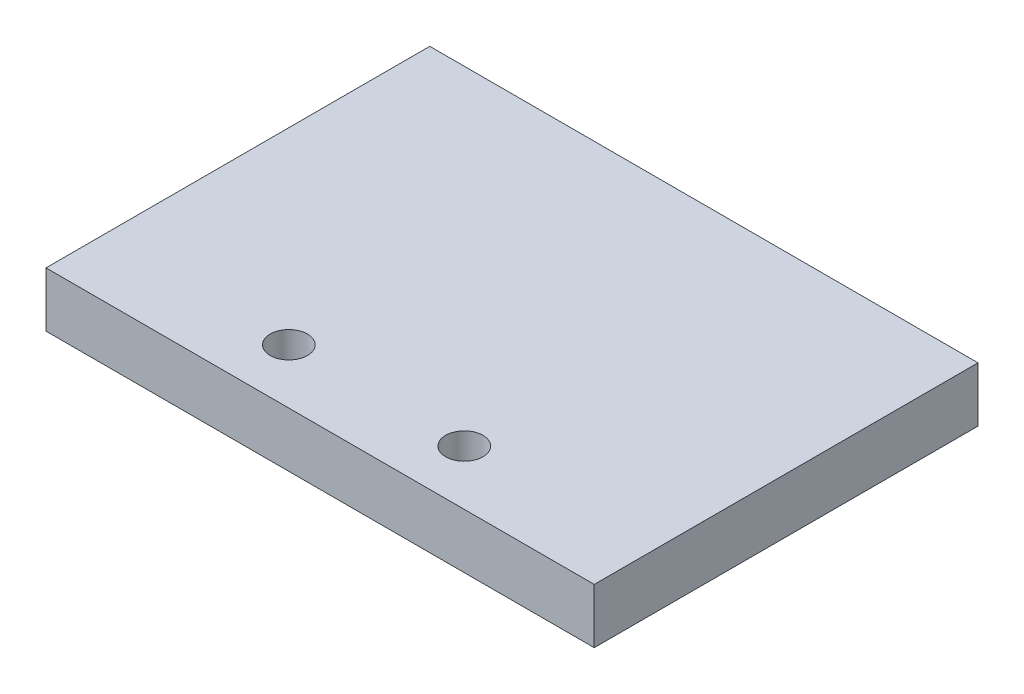
ISO-10303-21;
HEADER;
FILE_DESCRIPTION(('STEP AP214'),'2;1');
FILE_NAME('part.step','',(''),(''),'','','');
FILE_SCHEMA(('AUTOMOTIVE_DESIGN { 1 0 10303 214 1 1 1 1 }'));
ENDSEC;
DATA;
#1=APPLICATION_CONTEXT('core data for automotive mechanical design processes');
#2=APPLICATION_PROTOCOL_DEFINITION('international standard','automotive_design',2000,#1);
#3=PRODUCT_CONTEXT('',#1,'mechanical');
#4=PRODUCT('Part','Part','',(#3));
#5=PRODUCT_RELATED_PRODUCT_CATEGORY('part','',(#4));
#6=PRODUCT_DEFINITION_FORMATION('','',#4);
#7=PRODUCT_DEFINITION_CONTEXT('part definition',#1,'design');
#8=PRODUCT_DEFINITION('design','',#6,#7);
#9=PRODUCT_DEFINITION_SHAPE('','',#8);
#10=(LENGTH_UNIT() NAMED_UNIT(*) SI_UNIT(.MILLI.,.METRE.));
#11=(NAMED_UNIT(*) PLANE_ANGLE_UNIT() SI_UNIT($,.RADIAN.));
#12=(NAMED_UNIT(*) SI_UNIT($,.STERADIAN.) SOLID_ANGLE_UNIT());
#13=UNCERTAINTY_MEASURE_WITH_UNIT(LENGTH_MEASURE(1.E-05),#10,'distance_accuracy_value','');
#14=(GEOMETRIC_REPRESENTATION_CONTEXT(3) GLOBAL_UNCERTAINTY_ASSIGNED_CONTEXT((#13)) GLOBAL_UNIT_ASSIGNED_CONTEXT((#10,
#11,#12)) REPRESENTATION_CONTEXT('',''));
#15=CARTESIAN_POINT('',(0.,0.,0.));
#16=DIRECTION('',(0.,0.,1.));
#17=DIRECTION('',(1.,0.,0.));
#18=AXIS2_PLACEMENT_3D('',#15,#16,#17);
#19=CARTESIAN_POINT('',(25.,5.,17.5));
#20=DIRECTION('',(-1.,0.,0.));
#21=DIRECTION('',(0.,0.,1.));
#22=AXIS2_PLACEMENT_3D('',#19,#20,#21);
#23=PLANE('',#22);
#24=DIRECTION('',(0.,0.,-1.));
#25=VECTOR('',#24,1.);
#26=CARTESIAN_POINT('',(25.,0.,17.5));
#27=LINE('',#26,#25);
#28=CARTESIAN_POINT('',(25.,0.,17.5));
#29=VERTEX_POINT('',#28);
#30=CARTESIAN_POINT('',(25.,0.,-17.5));
#31=VERTEX_POINT('',#30);
#32=EDGE_CURVE('E96',#29,#31,#27,.T.);
#33=ORIENTED_EDGE('',*,*,#32,.T.);
#34=DIRECTION('',(0.,-1.,0.));
#35=VECTOR('',#34,1.);
#36=CARTESIAN_POINT('',(25.,5.,-17.5));
#37=LINE('',#36,#35);
#38=CARTESIAN_POINT('',(25.,5.,-17.5));
#39=VERTEX_POINT('',#38);
#40=EDGE_CURVE('E11',#39,#31,#37,.T.);
#41=ORIENTED_EDGE('',*,*,#40,.F.);
#42=DIRECTION('',(0.,0.,-1.));
#43=VECTOR('',#42,1.);
#44=CARTESIAN_POINT('',(25.,5.,17.5));
#45=LINE('',#44,#43);
#46=CARTESIAN_POINT('',(25.,5.,17.5));
#47=VERTEX_POINT('',#46);
#48=EDGE_CURVE('E84',#47,#39,#45,.T.);
#49=ORIENTED_EDGE('',*,*,#48,.F.);
#50=DIRECTION('',(0.,-1.,0.));
#51=VECTOR('',#50,1.);
#52=CARTESIAN_POINT('',(25.,5.,17.5));
#53=LINE('',#52,#51);
#54=EDGE_CURVE('E92',#47,#29,#53,.T.);
#55=ORIENTED_EDGE('',*,*,#54,.T.);
#56=EDGE_LOOP('',(#33,#41,#49,#55));
#57=FACE_BOUND('',#56,.T.);
#58=ADVANCED_FACE('F33',(#57),#23,.F.);
#59=CARTESIAN_POINT('',(-25.,5.,-17.5));
#60=DIRECTION('',(0.,0.,1.));
#61=DIRECTION('',(1.,0.,0.));
#62=AXIS2_PLACEMENT_3D('',#59,#60,#61);
#63=PLANE('',#62);
#64=DIRECTION('',(-1.,0.,0.));
#65=VECTOR('',#64,1.);
#66=CARTESIAN_POINT('',(-25.,0.,-17.5));
#67=LINE('',#66,#65);
#68=CARTESIAN_POINT('',(-25.,0.,-17.5));
#69=VERTEX_POINT('',#68);
#70=EDGE_CURVE('E88',#31,#69,#67,.T.);
#71=ORIENTED_EDGE('',*,*,#70,.T.);
#72=DIRECTION('',(0.,-1.,0.));
#73=VECTOR('',#72,1.);
#74=CARTESIAN_POINT('',(-25.,5.,-17.5));
#75=LINE('',#74,#73);
#76=CARTESIAN_POINT('',(-25.,5.,-17.5));
#77=VERTEX_POINT('',#76);
#78=EDGE_CURVE('E41',#77,#69,#75,.T.);
#79=ORIENTED_EDGE('',*,*,#78,.F.);
#80=DIRECTION('',(-1.,0.,0.));
#81=VECTOR('',#80,1.);
#82=CARTESIAN_POINT('',(-25.,5.,-17.5));
#83=LINE('',#82,#81);
#84=EDGE_CURVE('E79',#39,#77,#83,.T.);
#85=ORIENTED_EDGE('',*,*,#84,.F.);
#86=ORIENTED_EDGE('',*,*,#40,.T.);
#87=EDGE_LOOP('',(#71,#79,#85,#86));
#88=FACE_BOUND('',#87,.T.);
#89=ADVANCED_FACE('F87',(#88),#63,.F.);
#90=CARTESIAN_POINT('',(-25.,5.,17.5));
#91=DIRECTION('',(1.,0.,0.));
#92=DIRECTION('',(0.,0.,-1.));
#93=AXIS2_PLACEMENT_3D('',#90,#91,#92);
#94=PLANE('',#93);
#95=DIRECTION('',(0.,0.,1.));
#96=VECTOR('',#95,1.);
#97=CARTESIAN_POINT('',(-25.,0.,17.5));
#98=LINE('',#97,#96);
#99=CARTESIAN_POINT('',(-25.,0.,17.5));
#100=VERTEX_POINT('',#99);
#101=EDGE_CURVE('E66',#69,#100,#98,.T.);
#102=ORIENTED_EDGE('',*,*,#101,.T.);
#103=DIRECTION('',(0.,-1.,0.));
#104=VECTOR('',#103,1.);
#105=CARTESIAN_POINT('',(-25.,5.,17.5));
#106=LINE('',#105,#104);
#107=CARTESIAN_POINT('',(-25.,5.,17.5));
#108=VERTEX_POINT('',#107);
#109=EDGE_CURVE('E89',#108,#100,#106,.T.);
#110=ORIENTED_EDGE('',*,*,#109,.F.);
#111=DIRECTION('',(0.,0.,1.));
#112=VECTOR('',#111,1.);
#113=CARTESIAN_POINT('',(-25.,5.,17.5));
#114=LINE('',#113,#112);
#115=EDGE_CURVE('E82',#77,#108,#114,.T.);
#116=ORIENTED_EDGE('',*,*,#115,.F.);
#117=ORIENTED_EDGE('',*,*,#78,.T.);
#118=EDGE_LOOP('',(#102,#110,#116,#117));
#119=FACE_BOUND('',#118,.T.);
#120=ADVANCED_FACE('F90',(#119),#94,.F.);
#121=CARTESIAN_POINT('',(-25.,5.,17.5));
#122=DIRECTION('',(0.,0.,-1.));
#123=DIRECTION('',(-1.,0.,0.));
#124=AXIS2_PLACEMENT_3D('',#121,#122,#123);
#125=PLANE('',#124);
#126=DIRECTION('',(1.,0.,0.));
#127=VECTOR('',#126,1.);
#128=CARTESIAN_POINT('',(-25.,0.,17.5));
#129=LINE('',#128,#127);
#130=EDGE_CURVE('E72',#100,#29,#129,.T.);
#131=ORIENTED_EDGE('',*,*,#130,.T.);
#132=ORIENTED_EDGE('',*,*,#54,.F.);
#133=DIRECTION('',(1.,0.,0.));
#134=VECTOR('',#133,1.);
#135=CARTESIAN_POINT('',(-25.,5.,17.5));
#136=LINE('',#135,#134);
#137=EDGE_CURVE('E49',#108,#47,#136,.T.);
#138=ORIENTED_EDGE('',*,*,#137,.F.);
#139=ORIENTED_EDGE('',*,*,#109,.T.);
#140=EDGE_LOOP('',(#131,#132,#138,#139));
#141=FACE_BOUND('',#140,.T.);
#142=ADVANCED_FACE('F104',(#141),#125,.F.);
#143=CARTESIAN_POINT('',(0.,5.,0.));
#144=DIRECTION('',(0.,-1.,0.));
#145=DIRECTION('',(0.,0.,-1.));
#146=AXIS2_PLACEMENT_3D('',#143,#144,#145);
#147=PLANE('',#146);
#148=CARTESIAN_POINT('',(-7.85313595425129,5.,12.5));
#149=DIRECTION('',(0.,1.,0.));
#150=DIRECTION('',(0.,0.,1.));
#151=AXIS2_PLACEMENT_3D('',#148,#149,#150);
#152=CIRCLE('',#151,1.69999999999999);
#153=CARTESIAN_POINT('',(-7.85313595425129,5.,14.2));
#154=VERTEX_POINT('',#153);
#155=EDGE_CURVE('E118',#154,#154,#152,.T.);
#156=ORIENTED_EDGE('',*,*,#155,.F.);
#157=EDGE_LOOP('',(#156));
#158=FACE_BOUND('',#157,.T.);
#159=CARTESIAN_POINT('',(8.14686404574871,5.,12.5));
#160=DIRECTION('',(0.,1.,0.));
#161=DIRECTION('',(0.,0.,1.));
#162=AXIS2_PLACEMENT_3D('',#159,#160,#161);
#163=CIRCLE('',#162,1.69999999999999);
#164=CARTESIAN_POINT('',(8.14686404574871,5.,14.2));
#165=VERTEX_POINT('',#164);
#166=EDGE_CURVE('E112',#165,#165,#163,.T.);
#167=ORIENTED_EDGE('',*,*,#166,.F.);
#168=EDGE_LOOP('',(#167));
#169=FACE_BOUND('',#168,.T.);
#170=ORIENTED_EDGE('',*,*,#48,.T.);
#171=ORIENTED_EDGE('',*,*,#84,.T.);
#172=ORIENTED_EDGE('',*,*,#115,.T.);
#173=ORIENTED_EDGE('',*,*,#137,.T.);
#174=EDGE_LOOP('',(#170,#171,#172,#173));
#175=FACE_BOUND('',#174,.T.);
#176=ADVANCED_FACE('F80',(#158,#169,#175),#147,.F.);
#177=CARTESIAN_POINT('',(0.,0.,0.));
#178=DIRECTION('',(0.,-1.,0.));
#179=DIRECTION('',(0.,0.,-1.));
#180=AXIS2_PLACEMENT_3D('',#177,#178,#179);
#181=PLANE('',#180);
#182=CARTESIAN_POINT('',(-7.85313595425129,0.,12.5));
#183=DIRECTION('',(0.,1.,0.));
#184=DIRECTION('',(0.,0.,1.));
#185=AXIS2_PLACEMENT_3D('',#182,#183,#184);
#186=CIRCLE('',#185,1.7);
#187=CARTESIAN_POINT('',(-7.85313595425129,0.,14.2));
#188=VERTEX_POINT('',#187);
#189=EDGE_CURVE('E115',#188,#188,#186,.T.);
#190=ORIENTED_EDGE('',*,*,#189,.T.);
#191=EDGE_LOOP('',(#190));
#192=FACE_BOUND('',#191,.T.);
#193=CARTESIAN_POINT('',(8.14686404574871,0.,12.5));
#194=DIRECTION('',(0.,1.,0.));
#195=DIRECTION('',(0.,0.,1.));
#196=AXIS2_PLACEMENT_3D('',#193,#194,#195);
#197=CIRCLE('',#196,1.7);
#198=CARTESIAN_POINT('',(8.14686404574871,0.,14.2));
#199=VERTEX_POINT('',#198);
#200=EDGE_CURVE('E99',#199,#199,#197,.T.);
#201=ORIENTED_EDGE('',*,*,#200,.T.);
#202=EDGE_LOOP('',(#201));
#203=FACE_BOUND('',#202,.T.);
#204=ORIENTED_EDGE('',*,*,#32,.F.);
#205=ORIENTED_EDGE('',*,*,#130,.F.);
#206=ORIENTED_EDGE('',*,*,#101,.F.);
#207=ORIENTED_EDGE('',*,*,#70,.F.);
#208=EDGE_LOOP('',(#204,#205,#206,#207));
#209=FACE_BOUND('',#208,.T.);
#210=ADVANCED_FACE('F107',(#192,#203,#209),#181,.T.);
#211=CARTESIAN_POINT('',(8.14686404574871,5.,12.5));
#212=DIRECTION('',(0.,1.,0.));
#213=DIRECTION('',(0.,0.,1.));
#214=AXIS2_PLACEMENT_3D('',#211,#212,#213);
#215=CYLINDRICAL_SURFACE('',#214,1.69999999999999);
#216=ORIENTED_EDGE('',*,*,#200,.F.);
#217=EDGE_LOOP('',(#216));
#218=FACE_BOUND('',#217,.T.);
#219=ORIENTED_EDGE('',*,*,#166,.T.);
#220=EDGE_LOOP('',(#219));
#221=FACE_BOUND('',#220,.T.);
#222=ADVANCED_FACE('F129',(#218,#221),#215,.F.);
#223=CARTESIAN_POINT('',(-7.85313595425129,5.,12.5));
#224=DIRECTION('',(0.,1.,0.));
#225=DIRECTION('',(0.,0.,1.));
#226=AXIS2_PLACEMENT_3D('',#223,#224,#225);
#227=CYLINDRICAL_SURFACE('',#226,1.69999999999999);
#228=ORIENTED_EDGE('',*,*,#189,.F.);
#229=EDGE_LOOP('',(#228));
#230=FACE_BOUND('',#229,.T.);
#231=ORIENTED_EDGE('',*,*,#155,.T.);
#232=EDGE_LOOP('',(#231));
#233=FACE_BOUND('',#232,.T.);
#234=ADVANCED_FACE('F122',(#230,#233),#227,.F.);
#235=CLOSED_SHELL('',(#58,#89,#120,#142,#176,#210,#222,#234));
#236=MANIFOLD_SOLID_BREP('B2',#235);
#237=ADVANCED_BREP_SHAPE_REPRESENTATION('',(#18,#236),#14);
#238=SHAPE_DEFINITION_REPRESENTATION(#9,#237);
ENDSEC;
END-ISO-10303-21;
